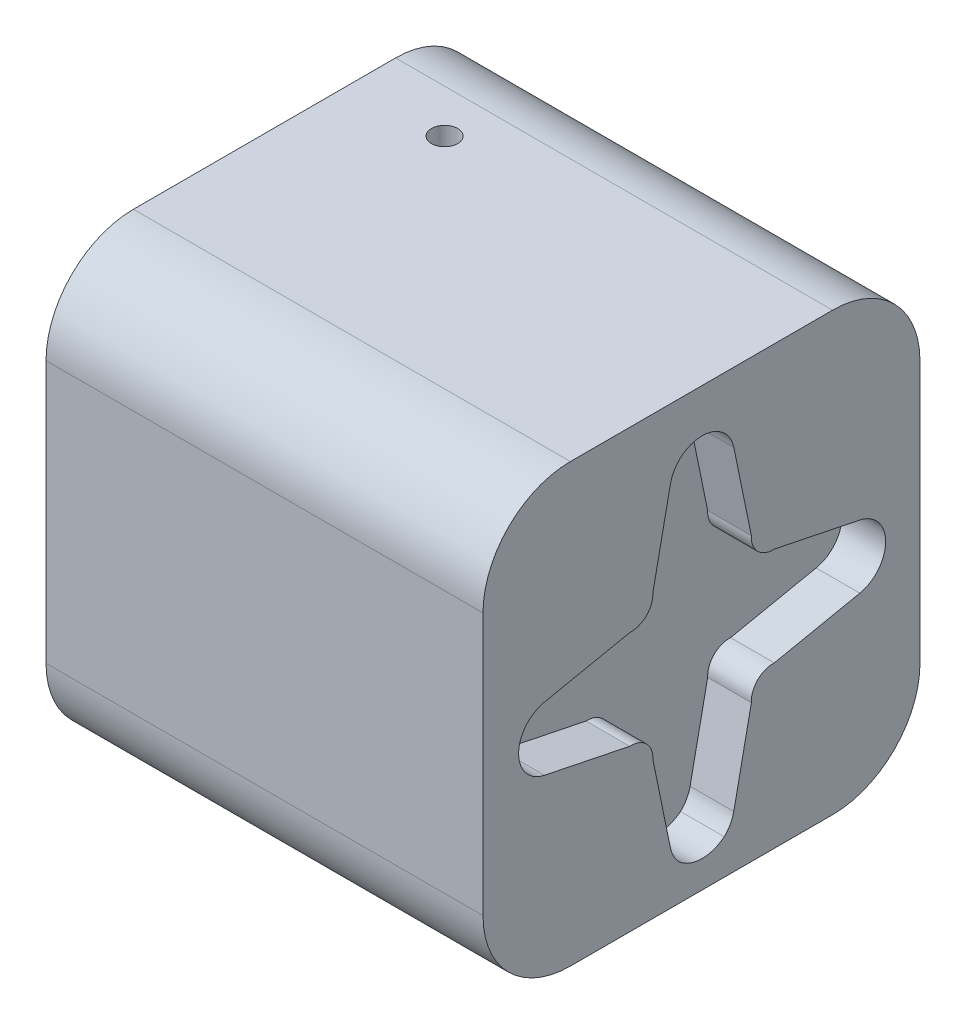
ISO-10303-21;
HEADER;
FILE_DESCRIPTION(('STEP AP214'),'2;1');
FILE_NAME('part.step','',(''),(''),'','','');
FILE_SCHEMA(('AUTOMOTIVE_DESIGN { 1 0 10303 214 1 1 1 1 }'));
ENDSEC;
DATA;
#1=APPLICATION_CONTEXT('core data for automotive mechanical design processes');
#2=APPLICATION_PROTOCOL_DEFINITION('international standard','automotive_design',2000,#1);
#3=PRODUCT_CONTEXT('',#1,'mechanical');
#4=PRODUCT('Part','Part','',(#3));
#5=PRODUCT_RELATED_PRODUCT_CATEGORY('part','',(#4));
#6=PRODUCT_DEFINITION_FORMATION('','',#4);
#7=PRODUCT_DEFINITION_CONTEXT('part definition',#1,'design');
#8=PRODUCT_DEFINITION('design','',#6,#7);
#9=PRODUCT_DEFINITION_SHAPE('','',#8);
#10=(LENGTH_UNIT() NAMED_UNIT(*) SI_UNIT(.MILLI.,.METRE.));
#11=(NAMED_UNIT(*) PLANE_ANGLE_UNIT() SI_UNIT($,.RADIAN.));
#12=(NAMED_UNIT(*) SI_UNIT($,.STERADIAN.) SOLID_ANGLE_UNIT());
#13=UNCERTAINTY_MEASURE_WITH_UNIT(LENGTH_MEASURE(1.E-05),#10,'distance_accuracy_value','');
#14=(GEOMETRIC_REPRESENTATION_CONTEXT(3) GLOBAL_UNCERTAINTY_ASSIGNED_CONTEXT((#13)) GLOBAL_UNIT_ASSIGNED_CONTEXT((#10,
#11,#12)) REPRESENTATION_CONTEXT('',''));
#15=CARTESIAN_POINT('',(0.,0.,0.));
#16=DIRECTION('',(0.,0.,1.));
#17=DIRECTION('',(1.,0.,0.));
#18=AXIS2_PLACEMENT_3D('',#15,#16,#17);
#19=CARTESIAN_POINT('',(0.,0.,50.));
#20=DIRECTION('',(1.,0.,0.));
#21=DIRECTION('',(0.,1.,0.));
#22=AXIS2_PLACEMENT_3D('',#19,#20,#21);
#23=PLANE('',#22);
#24=CARTESIAN_POINT('',(0.,24.8562562066084,24.9768909965409));
#25=DIRECTION('',(-1.,0.,0.));
#26=DIRECTION('',(0.,0.,1.));
#27=AXIS2_PLACEMENT_3D('',#24,#25,#26);
#28=CIRCLE('',#27,6.);
#29=CARTESIAN_POINT('',(0.,24.8562562066084,30.9768909965409));
#30=VERTEX_POINT('',#29);
#31=EDGE_CURVE('E364',#30,#30,#28,.T.);
#32=ORIENTED_EDGE('',*,*,#31,.F.);
#33=EDGE_LOOP('',(#32));
#34=FACE_BOUND('',#33,.T.);
#35=DIRECTION('',(0.,-1.,0.));
#36=VECTOR('',#35,1.);
#37=CARTESIAN_POINT('',(0.,0.,0.));
#38=LINE('',#37,#36);
#39=CARTESIAN_POINT('',(0.,40.,0.));
#40=VERTEX_POINT('',#39);
#41=CARTESIAN_POINT('',(0.,10.,0.));
#42=VERTEX_POINT('',#41);
#43=EDGE_CURVE('E370',#40,#42,#38,.T.);
#44=ORIENTED_EDGE('',*,*,#43,.T.);
#45=CARTESIAN_POINT('',(0.,10.,10.));
#46=DIRECTION('',(1.,0.,0.));
#47=DIRECTION('',(0.,1.,0.));
#48=AXIS2_PLACEMENT_3D('',#45,#46,#47);
#49=CIRCLE('',#48,10.);
#50=CARTESIAN_POINT('',(0.,0.,10.));
#51=VERTEX_POINT('',#50);
#52=EDGE_CURVE('E418',#42,#51,#49,.F.);
#53=ORIENTED_EDGE('',*,*,#52,.T.);
#54=DIRECTION('',(0.,0.,-1.));
#55=VECTOR('',#54,1.);
#56=CARTESIAN_POINT('',(0.,0.,50.));
#57=LINE('',#56,#55);
#58=CARTESIAN_POINT('',(0.,0.,40.));
#59=VERTEX_POINT('',#58);
#60=EDGE_CURVE('E393',#59,#51,#57,.T.);
#61=ORIENTED_EDGE('',*,*,#60,.F.);
#62=CARTESIAN_POINT('',(0.,10.,40.));
#63=DIRECTION('',(1.,0.,0.));
#64=DIRECTION('',(0.,1.,0.));
#65=AXIS2_PLACEMENT_3D('',#62,#63,#64);
#66=CIRCLE('',#65,10.);
#67=CARTESIAN_POINT('',(0.,10.,50.));
#68=VERTEX_POINT('',#67);
#69=EDGE_CURVE('E416',#59,#68,#66,.F.);
#70=ORIENTED_EDGE('',*,*,#69,.T.);
#71=DIRECTION('',(0.,-1.,0.));
#72=VECTOR('',#71,1.);
#73=CARTESIAN_POINT('',(0.,0.,50.));
#74=LINE('',#73,#72);
#75=CARTESIAN_POINT('',(0.,40.,50.));
#76=VERTEX_POINT('',#75);
#77=EDGE_CURVE('E373',#76,#68,#74,.T.);
#78=ORIENTED_EDGE('',*,*,#77,.F.);
#79=CARTESIAN_POINT('',(0.,40.,40.));
#80=DIRECTION('',(1.,0.,0.));
#81=DIRECTION('',(0.,1.,0.));
#82=AXIS2_PLACEMENT_3D('',#79,#80,#81);
#83=CIRCLE('',#82,10.);
#84=CARTESIAN_POINT('',(0.,50.,40.));
#85=VERTEX_POINT('',#84);
#86=EDGE_CURVE('E413',#76,#85,#83,.F.);
#87=ORIENTED_EDGE('',*,*,#86,.T.);
#88=DIRECTION('',(0.,0.,-1.));
#89=VECTOR('',#88,1.);
#90=CARTESIAN_POINT('',(0.,50.,50.));
#91=LINE('',#90,#89);
#92=CARTESIAN_POINT('',(0.,50.,10.));
#93=VERTEX_POINT('',#92);
#94=EDGE_CURVE('E380',#85,#93,#91,.T.);
#95=ORIENTED_EDGE('',*,*,#94,.T.);
#96=CARTESIAN_POINT('',(0.,40.,10.));
#97=DIRECTION('',(1.,0.,0.));
#98=DIRECTION('',(0.,1.,0.));
#99=AXIS2_PLACEMENT_3D('',#96,#97,#98);
#100=CIRCLE('',#99,10.);
#101=EDGE_CURVE('E60',#93,#40,#100,.F.);
#102=ORIENTED_EDGE('',*,*,#101,.T.);
#103=EDGE_LOOP('',(#44,#53,#61,#70,#78,#87,#95,#102));
#104=FACE_BOUND('',#103,.T.);
#105=ADVANCED_FACE('F37',(#34,#104),#23,.F.);
#106=CARTESIAN_POINT('',(0.,0.,50.));
#107=DIRECTION('',(0.,1.,0.));
#108=DIRECTION('',(0.,0.,1.));
#109=AXIS2_PLACEMENT_3D('',#106,#107,#108);
#110=PLANE('',#109);
#111=ORIENTED_EDGE('',*,*,#60,.T.);
#112=DIRECTION('',(1.,0.,0.));
#113=VECTOR('',#112,1.);
#114=CARTESIAN_POINT('',(50.,0.,10.));
#115=LINE('',#114,#113);
#116=CARTESIAN_POINT('',(50.,0.,10.));
#117=VERTEX_POINT('',#116);
#118=EDGE_CURVE('E398',#51,#117,#115,.T.);
#119=ORIENTED_EDGE('',*,*,#118,.T.);
#120=DIRECTION('',(0.,0.,-1.));
#121=VECTOR('',#120,1.);
#122=CARTESIAN_POINT('',(50.,0.,50.));
#123=LINE('',#122,#121);
#124=CARTESIAN_POINT('',(50.,0.,40.));
#125=VERTEX_POINT('',#124);
#126=EDGE_CURVE('E390',#125,#117,#123,.T.);
#127=ORIENTED_EDGE('',*,*,#126,.F.);
#128=DIRECTION('',(1.,0.,0.));
#129=VECTOR('',#128,1.);
#130=CARTESIAN_POINT('',(0.,0.,40.));
#131=LINE('',#130,#129);
#132=EDGE_CURVE('E396',#125,#59,#131,.F.);
#133=ORIENTED_EDGE('',*,*,#132,.T.);
#134=EDGE_LOOP('',(#111,#119,#127,#133));
#135=FACE_BOUND('',#134,.T.);
#136=ADVANCED_FACE('F449',(#135),#110,.F.);
#137=CARTESIAN_POINT('',(50.,0.,50.));
#138=DIRECTION('',(-1.,0.,0.));
#139=DIRECTION('',(0.,-1.,0.));
#140=AXIS2_PLACEMENT_3D('',#137,#138,#139);
#141=PLANE('',#140);
#142=CARTESIAN_POINT('',(50.,6.71979854378887,24.9265546119493));
#143=DIRECTION('',(1.,0.,0.));
#144=DIRECTION('',(0.,0.,1.));
#145=AXIS2_PLACEMENT_3D('',#142,#143,#144);
#146=CIRCLE('',#145,3.69999999999998);
#147=CARTESIAN_POINT('',(50.,4.01979854378889,22.3967324838146));
#148=VERTEX_POINT('',#147);
#149=CARTESIAN_POINT('',(50.,5.9744061390126,21.3024146915128));
#150=VERTEX_POINT('',#149);
#151=EDGE_CURVE('E281',#148,#150,#146,.T.);
#152=ORIENTED_EDGE('',*,*,#151,.F.);
#153=CARTESIAN_POINT('',(50.,7.14141936196997,24.9265546119493));
#154=DIRECTION('',(1.,0.,0.));
#155=DIRECTION('',(0.,0.,1.));
#156=AXIS2_PLACEMENT_3D('',#153,#154,#155);
#157=CIRCLE('',#156,4.01802395867688);
#158=CARTESIAN_POINT('',(50.,4.01979854378889,27.456376740084));
#159=VERTEX_POINT('',#158);
#160=EDGE_CURVE('E52',#159,#148,#157,.T.);
#161=ORIENTED_EDGE('',*,*,#160,.F.);
#162=CARTESIAN_POINT('',(50.,6.71979854378887,24.9265546119493));
#163=DIRECTION('',(1.,0.,0.));
#164=DIRECTION('',(0.,0.,1.));
#165=AXIS2_PLACEMENT_3D('',#162,#163,#164);
#166=CIRCLE('',#165,3.69999999999998);
#167=CARTESIAN_POINT('',(50.,5.97440613901261,28.5506945323859));
#168=VERTEX_POINT('',#167);
#169=EDGE_CURVE('E231',#168,#159,#166,.T.);
#170=ORIENTED_EDGE('',*,*,#169,.F.);
#171=DIRECTION('',(0.,-0.979497275793663,-0.201457406696287));
#172=VECTOR('',#171,1.);
#173=CARTESIAN_POINT('',(50.,15.7531316322469,30.5619269547176));
#174=LINE('',#173,#172);
#175=CARTESIAN_POINT('',(50.,15.7531316322469,30.5619269547176));
#176=VERTEX_POINT('',#175);
#177=EDGE_CURVE('E234',#176,#168,#174,.T.);
#178=ORIENTED_EDGE('',*,*,#177,.F.);
#179=CARTESIAN_POINT('',(50.,15.8880705601436,33.0582825955946));
#180=DIRECTION('',(-1.,0.,0.));
#181=DIRECTION('',(0.,0.,1.));
#182=AXIS2_PLACEMENT_3D('',#179,#180,#181);
#183=CIRCLE('',#182,2.5);
#184=CARTESIAN_POINT('',(50.,18.3844262010205,33.1932215234913));
#185=VERTEX_POINT('',#184);
#186=EDGE_CURVE('E322',#185,#176,#183,.T.);
#187=ORIENTED_EDGE('',*,*,#186,.F.);
#188=DIRECTION('',(0.,-0.201457406696296,-0.979497275793661));
#189=VECTOR('',#188,1.);
#190=CARTESIAN_POINT('',(50.,18.3844262010205,33.1932215234913));
#191=LINE('',#190,#189);
#192=CARTESIAN_POINT('',(50.,20.3956586233524,42.9719470167256));
#193=VERTEX_POINT('',#192);
#194=EDGE_CURVE('E319',#193,#185,#191,.T.);
#195=ORIENTED_EDGE('',*,*,#194,.F.);
#196=CARTESIAN_POINT('',(50.,24.0197985437889,42.2265546119493));
#197=DIRECTION('',(1.,0.,0.));
#198=DIRECTION('',(0.,0.,-1.));
#199=AXIS2_PLACEMENT_3D('',#196,#197,#198);
#200=CIRCLE('',#199,3.7);
#201=CARTESIAN_POINT('',(50.,27.6439384642254,42.9719470167256));
#202=VERTEX_POINT('',#201);
#203=EDGE_CURVE('E316',#202,#193,#200,.T.);
#204=ORIENTED_EDGE('',*,*,#203,.F.);
#205=DIRECTION('',(0.,-0.201457406696295,0.979497275793661));
#206=VECTOR('',#205,1.);
#207=CARTESIAN_POINT('',(50.,29.6551708865573,33.1932215234912));
#208=LINE('',#207,#206);
#209=CARTESIAN_POINT('',(50.,29.6551708865573,33.1932215234912));
#210=VERTEX_POINT('',#209);
#211=EDGE_CURVE('E313',#210,#202,#208,.T.);
#212=ORIENTED_EDGE('',*,*,#211,.F.);
#213=CARTESIAN_POINT('',(50.,32.1515265274343,33.0582825955946));
#214=DIRECTION('',(-1.,0.,0.));
#215=DIRECTION('',(0.,0.,-1.));
#216=AXIS2_PLACEMENT_3D('',#213,#214,#215);
#217=CIRCLE('',#216,2.50000000000001);
#218=CARTESIAN_POINT('',(50.,32.2864654553309,30.5619269547176));
#219=VERTEX_POINT('',#218);
#220=EDGE_CURVE('E310',#219,#210,#217,.T.);
#221=ORIENTED_EDGE('',*,*,#220,.F.);
#222=DIRECTION('',(0.,-0.979497275793663,0.201457406696289));
#223=VECTOR('',#222,1.);
#224=CARTESIAN_POINT('',(50.,32.2864654553309,30.5619269547176));
#225=LINE('',#224,#223);
#226=CARTESIAN_POINT('',(50.,42.0651909485652,28.5506945323858));
#227=VERTEX_POINT('',#226);
#228=EDGE_CURVE('E307',#227,#219,#225,.T.);
#229=ORIENTED_EDGE('',*,*,#228,.F.);
#230=CARTESIAN_POINT('',(50.,41.3197985437889,24.9265546119493));
#231=DIRECTION('',(1.,0.,0.));
#232=DIRECTION('',(0.,0.,-1.));
#233=AXIS2_PLACEMENT_3D('',#230,#231,#232);
#234=CIRCLE('',#233,3.69999999999999);
#235=CARTESIAN_POINT('',(50.,42.0651909485652,21.3024146915128));
#236=VERTEX_POINT('',#235);
#237=EDGE_CURVE('E304',#236,#227,#234,.T.);
#238=ORIENTED_EDGE('',*,*,#237,.F.);
#239=DIRECTION('',(0.,0.979497275793662,0.201457406696289));
#240=VECTOR('',#239,1.);
#241=CARTESIAN_POINT('',(50.,32.2864654553309,19.291182269181));
#242=LINE('',#241,#240);
#243=CARTESIAN_POINT('',(50.,32.2864654553309,19.291182269181));
#244=VERTEX_POINT('',#243);
#245=EDGE_CURVE('E301',#244,#236,#242,.T.);
#246=ORIENTED_EDGE('',*,*,#245,.F.);
#247=CARTESIAN_POINT('',(50.,32.1515265274342,16.7948266283041));
#248=DIRECTION('',(-1.,0.,0.));
#249=DIRECTION('',(0.,0.,1.));
#250=AXIS2_PLACEMENT_3D('',#247,#248,#249);
#251=CIRCLE('',#250,2.5);
#252=CARTESIAN_POINT('',(50.,29.6551708865573,16.6598877004074));
#253=VERTEX_POINT('',#252);
#254=EDGE_CURVE('E298',#253,#244,#251,.T.);
#255=ORIENTED_EDGE('',*,*,#254,.F.);
#256=DIRECTION('',(0.,0.201457406696297,0.979497275793661));
#257=VECTOR('',#256,1.);
#258=CARTESIAN_POINT('',(50.,29.6551708865573,16.6598877004074));
#259=LINE('',#258,#257);
#260=CARTESIAN_POINT('',(50.,27.6439384642254,6.88116220717301));
#261=VERTEX_POINT('',#260);
#262=EDGE_CURVE('E295',#261,#253,#259,.T.);
#263=ORIENTED_EDGE('',*,*,#262,.F.);
#264=CARTESIAN_POINT('',(50.,24.0197985437889,7.62655461194931));
#265=DIRECTION('',(1.,0.,0.));
#266=DIRECTION('',(0.,0.,1.));
#267=AXIS2_PLACEMENT_3D('',#264,#265,#266);
#268=CIRCLE('',#267,3.7);
#269=CARTESIAN_POINT('',(50.,20.3956586233524,6.88116220717299));
#270=VERTEX_POINT('',#269);
#271=EDGE_CURVE('E292',#270,#261,#268,.T.);
#272=ORIENTED_EDGE('',*,*,#271,.F.);
#273=DIRECTION('',(0.,0.201457406696295,-0.979497275793661));
#274=VECTOR('',#273,1.);
#275=CARTESIAN_POINT('',(50.,18.3844262010205,16.6598877004073));
#276=LINE('',#275,#274);
#277=CARTESIAN_POINT('',(50.,18.3844262010205,16.6598877004073));
#278=VERTEX_POINT('',#277);
#279=EDGE_CURVE('E289',#278,#270,#276,.T.);
#280=ORIENTED_EDGE('',*,*,#279,.F.);
#281=CARTESIAN_POINT('',(50.,15.8880705601436,16.7948266283041));
#282=DIRECTION('',(-1.,0.,0.));
#283=DIRECTION('',(0.,0.,-1.));
#284=AXIS2_PLACEMENT_3D('',#281,#282,#283);
#285=CIRCLE('',#284,2.5);
#286=CARTESIAN_POINT('',(50.,15.7531316322469,19.291182269181));
#287=VERTEX_POINT('',#286);
#288=EDGE_CURVE('E286',#287,#278,#285,.T.);
#289=ORIENTED_EDGE('',*,*,#288,.F.);
#290=DIRECTION('',(0.,0.979497275793662,-0.20145740669629));
#291=VECTOR('',#290,1.);
#292=CARTESIAN_POINT('',(50.,15.7531316322469,19.291182269181));
#293=LINE('',#292,#291);
#294=EDGE_CURVE('E283',#150,#287,#293,.T.);
#295=ORIENTED_EDGE('',*,*,#294,.F.);
#296=EDGE_LOOP('',(#152,#161,#170,#178,#187,#195,#204,#212,#221,#229,#238,#246,#255,#263,#272,
#280,#289,#295));
#297=FACE_BOUND('',#296,.T.);
#298=ORIENTED_EDGE('',*,*,#126,.T.);
#299=CARTESIAN_POINT('',(50.,10.,10.));
#300=DIRECTION('',(-1.,0.,0.));
#301=DIRECTION('',(0.,-1.,0.));
#302=AXIS2_PLACEMENT_3D('',#299,#300,#301);
#303=CIRCLE('',#302,10.);
#304=CARTESIAN_POINT('',(50.,10.,0.));
#305=VERTEX_POINT('',#304);
#306=EDGE_CURVE('E407',#117,#305,#303,.F.);
#307=ORIENTED_EDGE('',*,*,#306,.T.);
#308=DIRECTION('',(0.,1.,0.));
#309=VECTOR('',#308,1.);
#310=CARTESIAN_POINT('',(50.,0.,0.));
#311=LINE('',#310,#309);
#312=CARTESIAN_POINT('',(50.,40.,0.));
#313=VERTEX_POINT('',#312);
#314=EDGE_CURVE('E377',#305,#313,#311,.T.);
#315=ORIENTED_EDGE('',*,*,#314,.T.);
#316=CARTESIAN_POINT('',(50.,40.,10.));
#317=DIRECTION('',(-1.,0.,0.));
#318=DIRECTION('',(0.,-1.,0.));
#319=AXIS2_PLACEMENT_3D('',#316,#317,#318);
#320=CIRCLE('',#319,10.);
#321=CARTESIAN_POINT('',(50.,50.,10.));
#322=VERTEX_POINT('',#321);
#323=EDGE_CURVE('E403',#313,#322,#320,.F.);
#324=ORIENTED_EDGE('',*,*,#323,.T.);
#325=DIRECTION('',(0.,0.,-1.));
#326=VECTOR('',#325,1.);
#327=CARTESIAN_POINT('',(50.,50.,50.));
#328=LINE('',#327,#326);
#329=CARTESIAN_POINT('',(50.,50.,40.));
#330=VERTEX_POINT('',#329);
#331=EDGE_CURVE('E387',#330,#322,#328,.T.);
#332=ORIENTED_EDGE('',*,*,#331,.F.);
#333=CARTESIAN_POINT('',(50.,40.,40.));
#334=DIRECTION('',(-1.,0.,0.));
#335=DIRECTION('',(0.,-1.,0.));
#336=AXIS2_PLACEMENT_3D('',#333,#334,#335);
#337=CIRCLE('',#336,10.);
#338=CARTESIAN_POINT('',(50.,40.,50.));
#339=VERTEX_POINT('',#338);
#340=EDGE_CURVE('E401',#330,#339,#337,.F.);
#341=ORIENTED_EDGE('',*,*,#340,.T.);
#342=DIRECTION('',(0.,1.,0.));
#343=VECTOR('',#342,1.);
#344=CARTESIAN_POINT('',(50.,0.,50.));
#345=LINE('',#344,#343);
#346=CARTESIAN_POINT('',(50.,10.,50.));
#347=VERTEX_POINT('',#346);
#348=EDGE_CURVE('E376',#347,#339,#345,.T.);
#349=ORIENTED_EDGE('',*,*,#348,.F.);
#350=CARTESIAN_POINT('',(50.,10.,40.));
#351=DIRECTION('',(-1.,0.,0.));
#352=DIRECTION('',(0.,-1.,0.));
#353=AXIS2_PLACEMENT_3D('',#350,#351,#352);
#354=CIRCLE('',#353,10.);
#355=EDGE_CURVE('E405',#347,#125,#354,.F.);
#356=ORIENTED_EDGE('',*,*,#355,.T.);
#357=EDGE_LOOP('',(#298,#307,#315,#324,#332,#341,#349,#356));
#358=FACE_BOUND('',#357,.T.);
#359=ADVANCED_FACE('F433',(#297,#358),#141,.F.);
#360=CARTESIAN_POINT('',(0.,50.,50.));
#361=DIRECTION('',(0.,-1.,0.));
#362=DIRECTION('',(0.,0.,-1.));
#363=AXIS2_PLACEMENT_3D('',#360,#361,#362);
#364=PLANE('',#363);
#365=CARTESIAN_POINT('',(10.5467381359211,50.,14.9409623138058));
#366=DIRECTION('',(0.,1.,0.));
#367=DIRECTION('',(0.,0.,1.));
#368=AXIS2_PLACEMENT_3D('',#365,#366,#367);
#369=CIRCLE('',#368,1.5);
#370=CARTESIAN_POINT('',(10.5467381359211,50.,16.4409623138058));
#371=VERTEX_POINT('',#370);
#372=EDGE_CURVE('E329',#371,#371,#369,.T.);
#373=ORIENTED_EDGE('',*,*,#372,.F.);
#374=EDGE_LOOP('',(#373));
#375=FACE_BOUND('',#374,.T.);
#376=ORIENTED_EDGE('',*,*,#331,.T.);
#377=DIRECTION('',(-1.,0.,0.));
#378=VECTOR('',#377,1.);
#379=CARTESIAN_POINT('',(0.,50.,10.));
#380=LINE('',#379,#378);
#381=EDGE_CURVE('E11',#322,#93,#380,.T.);
#382=ORIENTED_EDGE('',*,*,#381,.T.);
#383=ORIENTED_EDGE('',*,*,#94,.F.);
#384=DIRECTION('',(-1.,0.,0.));
#385=VECTOR('',#384,1.);
#386=CARTESIAN_POINT('',(0.,50.,40.));
#387=LINE('',#386,#385);
#388=EDGE_CURVE('E45',#85,#330,#387,.F.);
#389=ORIENTED_EDGE('',*,*,#388,.T.);
#390=EDGE_LOOP('',(#376,#382,#383,#389));
#391=FACE_BOUND('',#390,.T.);
#392=ADVANCED_FACE('F429',(#375,#391),#364,.F.);
#393=CARTESIAN_POINT('',(0.,0.,50.));
#394=DIRECTION('',(0.,0.,-1.));
#395=DIRECTION('',(-1.,0.,0.));
#396=AXIS2_PLACEMENT_3D('',#393,#394,#395);
#397=PLANE('',#396);
#398=ORIENTED_EDGE('',*,*,#77,.T.);
#399=DIRECTION('',(1.,0.,0.));
#400=VECTOR('',#399,1.);
#401=CARTESIAN_POINT('',(0.,10.,50.));
#402=LINE('',#401,#400);
#403=EDGE_CURVE('E423',#68,#347,#402,.T.);
#404=ORIENTED_EDGE('',*,*,#403,.T.);
#405=ORIENTED_EDGE('',*,*,#348,.T.);
#406=DIRECTION('',(-1.,0.,0.));
#407=VECTOR('',#406,1.);
#408=CARTESIAN_POINT('',(0.,40.,50.));
#409=LINE('',#408,#407);
#410=EDGE_CURVE('E420',#339,#76,#409,.T.);
#411=ORIENTED_EDGE('',*,*,#410,.T.);
#412=EDGE_LOOP('',(#398,#404,#405,#411));
#413=FACE_BOUND('',#412,.T.);
#414=ADVANCED_FACE('F439',(#413),#397,.F.);
#415=CARTESIAN_POINT('',(0.,0.,0.));
#416=DIRECTION('',(0.,0.,-1.));
#417=DIRECTION('',(-1.,0.,0.));
#418=AXIS2_PLACEMENT_3D('',#415,#416,#417);
#419=PLANE('',#418);
#420=ORIENTED_EDGE('',*,*,#314,.F.);
#421=DIRECTION('',(1.,0.,0.));
#422=VECTOR('',#421,1.);
#423=CARTESIAN_POINT('',(0.,10.,0.));
#424=LINE('',#423,#422);
#425=EDGE_CURVE('E411',#305,#42,#424,.F.);
#426=ORIENTED_EDGE('',*,*,#425,.T.);
#427=ORIENTED_EDGE('',*,*,#43,.F.);
#428=DIRECTION('',(-1.,0.,0.));
#429=VECTOR('',#428,1.);
#430=CARTESIAN_POINT('',(50.,40.,0.));
#431=LINE('',#430,#429);
#432=EDGE_CURVE('E409',#40,#313,#431,.F.);
#433=ORIENTED_EDGE('',*,*,#432,.T.);
#434=EDGE_LOOP('',(#420,#426,#427,#433));
#435=FACE_BOUND('',#434,.T.);
#436=ADVANCED_FACE('F457',(#435),#419,.T.);
#437=CARTESIAN_POINT('',(40.,24.8562562066084,24.9768909965409));
#438=DIRECTION('',(-1.,0.,0.));
#439=DIRECTION('',(0.,0.,1.));
#440=AXIS2_PLACEMENT_3D('',#437,#438,#439);
#441=CYLINDRICAL_SURFACE('',#440,6.);
#442=CARTESIAN_POINT('',(40.,24.8562562066084,24.9768909965409));
#443=DIRECTION('',(-1.,0.,0.));
#444=DIRECTION('',(0.,0.,1.));
#445=AXIS2_PLACEMENT_3D('',#442,#443,#444);
#446=CIRCLE('',#445,6.);
#447=CARTESIAN_POINT('',(40.,24.8562562066084,30.9768909965409));
#448=VERTEX_POINT('',#447);
#449=EDGE_CURVE('E367',#448,#448,#446,.T.);
#450=ORIENTED_EDGE('',*,*,#449,.F.);
#451=EDGE_LOOP('',(#450));
#452=FACE_BOUND('',#451,.T.);
#453=ORIENTED_EDGE('',*,*,#31,.T.);
#454=EDGE_LOOP('',(#453));
#455=FACE_BOUND('',#454,.T.);
#456=ADVANCED_FACE('F482',(#452,#455),#441,.F.);
#457=CARTESIAN_POINT('',(40.,24.8562562066084,24.9768909965409));
#458=DIRECTION('',(-1.,0.,0.));
#459=DIRECTION('',(0.,0.,1.));
#460=AXIS2_PLACEMENT_3D('',#457,#458,#459);
#461=PLANE('',#460);
#462=ORIENTED_EDGE('',*,*,#449,.T.);
#463=EDGE_LOOP('',(#462));
#464=FACE_BOUND('',#463,.T.);
#465=ADVANCED_FACE('F478',(#464),#461,.T.);
#466=CARTESIAN_POINT('',(0.,10.,10.));
#467=DIRECTION('',(-1.,0.,0.));
#468=DIRECTION('',(0.,0.,1.));
#469=AXIS2_PLACEMENT_3D('',#466,#467,#468);
#470=CYLINDRICAL_SURFACE('',#469,10.);
#471=ORIENTED_EDGE('',*,*,#52,.F.);
#472=ORIENTED_EDGE('',*,*,#425,.F.);
#473=ORIENTED_EDGE('',*,*,#306,.F.);
#474=ORIENTED_EDGE('',*,*,#118,.F.);
#475=EDGE_LOOP('',(#471,#472,#473,#474));
#476=FACE_BOUND('',#475,.T.);
#477=ADVANCED_FACE('F453',(#476),#470,.T.);
#478=CARTESIAN_POINT('',(0.,10.,40.));
#479=DIRECTION('',(1.,0.,0.));
#480=DIRECTION('',(0.,0.,-1.));
#481=AXIS2_PLACEMENT_3D('',#478,#479,#480);
#482=CYLINDRICAL_SURFACE('',#481,10.);
#483=ORIENTED_EDGE('',*,*,#69,.F.);
#484=ORIENTED_EDGE('',*,*,#132,.F.);
#485=ORIENTED_EDGE('',*,*,#355,.F.);
#486=ORIENTED_EDGE('',*,*,#403,.F.);
#487=EDGE_LOOP('',(#483,#484,#485,#486));
#488=FACE_BOUND('',#487,.T.);
#489=ADVANCED_FACE('F446',(#488),#482,.T.);
#490=CARTESIAN_POINT('',(0.,40.,10.));
#491=DIRECTION('',(1.,0.,0.));
#492=DIRECTION('',(0.,0.,-1.));
#493=AXIS2_PLACEMENT_3D('',#490,#491,#492);
#494=CYLINDRICAL_SURFACE('',#493,10.);
#495=ORIENTED_EDGE('',*,*,#323,.F.);
#496=ORIENTED_EDGE('',*,*,#432,.F.);
#497=ORIENTED_EDGE('',*,*,#101,.F.);
#498=ORIENTED_EDGE('',*,*,#381,.F.);
#499=EDGE_LOOP('',(#495,#496,#497,#498));
#500=FACE_BOUND('',#499,.T.);
#501=ADVANCED_FACE('F459',(#500),#494,.T.);
#502=CARTESIAN_POINT('',(0.,40.,40.));
#503=DIRECTION('',(-1.,0.,0.));
#504=DIRECTION('',(0.,0.,1.));
#505=AXIS2_PLACEMENT_3D('',#502,#503,#504);
#506=CYLINDRICAL_SURFACE('',#505,10.);
#507=ORIENTED_EDGE('',*,*,#340,.F.);
#508=ORIENTED_EDGE('',*,*,#388,.F.);
#509=ORIENTED_EDGE('',*,*,#86,.F.);
#510=ORIENTED_EDGE('',*,*,#410,.F.);
#511=EDGE_LOOP('',(#507,#508,#509,#510));
#512=FACE_BOUND('',#511,.T.);
#513=ADVANCED_FACE('F39',(#512),#506,.T.);
#514=CARTESIAN_POINT('',(10.5467381359211,35.,14.9409623138058));
#515=DIRECTION('',(0.,1.,0.));
#516=DIRECTION('',(0.,0.,1.));
#517=AXIS2_PLACEMENT_3D('',#514,#515,#516);
#518=CYLINDRICAL_SURFACE('',#517,1.5);
#519=CARTESIAN_POINT('',(10.5467381359211,35.,14.9409623138058));
#520=DIRECTION('',(0.,1.,0.));
#521=DIRECTION('',(0.,0.,1.));
#522=AXIS2_PLACEMENT_3D('',#519,#520,#521);
#523=CIRCLE('',#522,1.5);
#524=CARTESIAN_POINT('',(10.5467381359211,35.,16.4409623138058));
#525=VERTEX_POINT('',#524);
#526=EDGE_CURVE('E361',#525,#525,#523,.T.);
#527=ORIENTED_EDGE('',*,*,#526,.F.);
#528=EDGE_LOOP('',(#527));
#529=FACE_BOUND('',#528,.T.);
#530=ORIENTED_EDGE('',*,*,#372,.T.);
#531=EDGE_LOOP('',(#530));
#532=FACE_BOUND('',#531,.T.);
#533=ADVANCED_FACE('F465',(#529,#532),#518,.F.);
#534=CARTESIAN_POINT('',(10.5467381359211,35.,14.9409623138058));
#535=DIRECTION('',(0.,1.,0.));
#536=DIRECTION('',(0.,0.,1.));
#537=AXIS2_PLACEMENT_3D('',#534,#535,#536);
#538=PLANE('',#537);
#539=ORIENTED_EDGE('',*,*,#526,.T.);
#540=EDGE_LOOP('',(#539));
#541=FACE_BOUND('',#540,.T.);
#542=ADVANCED_FACE('F572',(#541),#538,.T.);
#543=CARTESIAN_POINT('',(45.,7.14141936196997,24.9265546119493));
#544=DIRECTION('',(1.,0.,0.));
#545=DIRECTION('',(0.,0.,-1.));
#546=AXIS2_PLACEMENT_3D('',#543,#544,#545);
#547=CYLINDRICAL_SURFACE('',#546,4.01802395867688);
#548=ORIENTED_EDGE('',*,*,#160,.T.);
#549=DIRECTION('',(1.,0.,0.));
#550=VECTOR('',#549,1.);
#551=CARTESIAN_POINT('',(45.,4.01979854378889,22.3967324838146));
#552=LINE('',#551,#550);
#553=CARTESIAN_POINT('',(45.,4.01979854378889,22.3967324838146));
#554=VERTEX_POINT('',#553);
#555=EDGE_CURVE('E208',#554,#148,#552,.T.);
#556=ORIENTED_EDGE('',*,*,#555,.F.);
#557=CARTESIAN_POINT('',(45.,7.14141936196997,24.9265546119493));
#558=DIRECTION('',(1.,0.,0.));
#559=DIRECTION('',(0.,0.,1.));
#560=AXIS2_PLACEMENT_3D('',#557,#558,#559);
#561=CIRCLE('',#560,4.01802395867688);
#562=CARTESIAN_POINT('',(45.,4.01979854378889,27.456376740084));
#563=VERTEX_POINT('',#562);
#564=EDGE_CURVE('E212',#563,#554,#561,.T.);
#565=ORIENTED_EDGE('',*,*,#564,.F.);
#566=DIRECTION('',(1.,0.,0.));
#567=VECTOR('',#566,1.);
#568=CARTESIAN_POINT('',(45.,4.01979854378889,27.456376740084));
#569=LINE('',#568,#567);
#570=EDGE_CURVE('E327',#563,#159,#569,.T.);
#571=ORIENTED_EDGE('',*,*,#570,.T.);
#572=EDGE_LOOP('',(#548,#556,#565,#571));
#573=FACE_BOUND('',#572,.T.);
#574=ADVANCED_FACE('F210',(#573),#547,.F.);
#575=CARTESIAN_POINT('',(45.,6.71979854378887,24.9265546119493));
#576=DIRECTION('',(1.,0.,0.));
#577=DIRECTION('',(0.,0.,-1.));
#578=AXIS2_PLACEMENT_3D('',#575,#576,#577);
#579=CYLINDRICAL_SURFACE('',#578,3.69999999999998);
#580=ORIENTED_EDGE('',*,*,#169,.T.);
#581=ORIENTED_EDGE('',*,*,#570,.F.);
#582=CARTESIAN_POINT('',(45.,6.71979854378887,24.9265546119493));
#583=DIRECTION('',(1.,0.,0.));
#584=DIRECTION('',(0.,0.,1.));
#585=AXIS2_PLACEMENT_3D('',#582,#583,#584);
#586=CIRCLE('',#585,3.69999999999998);
#587=CARTESIAN_POINT('',(45.,5.97440613901261,28.5506945323859));
#588=VERTEX_POINT('',#587);
#589=EDGE_CURVE('E218',#588,#563,#586,.T.);
#590=ORIENTED_EDGE('',*,*,#589,.F.);
#591=DIRECTION('',(1.,0.,0.));
#592=VECTOR('',#591,1.);
#593=CARTESIAN_POINT('',(45.,5.97440613901261,28.5506945323859));
#594=LINE('',#593,#592);
#595=EDGE_CURVE('E330',#588,#168,#594,.T.);
#596=ORIENTED_EDGE('',*,*,#595,.T.);
#597=EDGE_LOOP('',(#580,#581,#590,#596));
#598=FACE_BOUND('',#597,.T.);
#599=ADVANCED_FACE('F564',(#598),#579,.F.);
#600=CARTESIAN_POINT('',(45.,15.7531316322469,30.5619269547176));
#601=DIRECTION('',(0.,-0.201457406696287,0.979497275793663));
#602=DIRECTION('',(0.,-0.979497275793663,-0.201457406696287));
#603=AXIS2_PLACEMENT_3D('',#600,#601,#602);
#604=PLANE('',#603);
#605=ORIENTED_EDGE('',*,*,#177,.T.);
#606=ORIENTED_EDGE('',*,*,#595,.F.);
#607=DIRECTION('',(0.,-0.979497275793663,-0.201457406696287));
#608=VECTOR('',#607,1.);
#609=CARTESIAN_POINT('',(45.,15.7531316322469,30.5619269547176));
#610=LINE('',#609,#608);
#611=CARTESIAN_POINT('',(45.,15.7531316322469,30.5619269547176));
#612=VERTEX_POINT('',#611);
#613=EDGE_CURVE('E277',#612,#588,#610,.T.);
#614=ORIENTED_EDGE('',*,*,#613,.F.);
#615=DIRECTION('',(1.,0.,0.));
#616=VECTOR('',#615,1.);
#617=CARTESIAN_POINT('',(45.,15.7531316322469,30.5619269547176));
#618=LINE('',#617,#616);
#619=EDGE_CURVE('E332',#612,#176,#618,.T.);
#620=ORIENTED_EDGE('',*,*,#619,.T.);
#621=EDGE_LOOP('',(#605,#606,#614,#620));
#622=FACE_BOUND('',#621,.T.);
#623=ADVANCED_FACE('F562',(#622),#604,.F.);
#624=CARTESIAN_POINT('',(45.,15.8880705601436,33.0582825955946));
#625=DIRECTION('',(1.,0.,0.));
#626=DIRECTION('',(0.,0.,-1.));
#627=AXIS2_PLACEMENT_3D('',#624,#625,#626);
#628=CYLINDRICAL_SURFACE('',#627,2.5);
#629=ORIENTED_EDGE('',*,*,#186,.T.);
#630=ORIENTED_EDGE('',*,*,#619,.F.);
#631=CARTESIAN_POINT('',(45.,15.8880705601436,33.0582825955946));
#632=DIRECTION('',(-1.,0.,0.));
#633=DIRECTION('',(0.,0.,1.));
#634=AXIS2_PLACEMENT_3D('',#631,#632,#633);
#635=CIRCLE('',#634,2.5);
#636=CARTESIAN_POINT('',(45.,18.3844262010205,33.1932215234913));
#637=VERTEX_POINT('',#636);
#638=EDGE_CURVE('E274',#637,#612,#635,.T.);
#639=ORIENTED_EDGE('',*,*,#638,.F.);
#640=DIRECTION('',(1.,0.,0.));
#641=VECTOR('',#640,1.);
#642=CARTESIAN_POINT('',(45.,18.3844262010205,33.1932215234913));
#643=LINE('',#642,#641);
#644=EDGE_CURVE('E334',#637,#185,#643,.T.);
#645=ORIENTED_EDGE('',*,*,#644,.T.);
#646=EDGE_LOOP('',(#629,#630,#639,#645));
#647=FACE_BOUND('',#646,.T.);
#648=ADVANCED_FACE('F558',(#647),#628,.T.);
#649=CARTESIAN_POINT('',(45.,18.3844262010205,33.1932215234913));
#650=DIRECTION('',(0.,-0.979497275793661,0.201457406696296));
#651=DIRECTION('',(0.,-0.201457406696296,-0.979497275793661));
#652=AXIS2_PLACEMENT_3D('',#649,#650,#651);
#653=PLANE('',#652);
#654=ORIENTED_EDGE('',*,*,#194,.T.);
#655=ORIENTED_EDGE('',*,*,#644,.F.);
#656=DIRECTION('',(0.,-0.201457406696296,-0.979497275793661));
#657=VECTOR('',#656,1.);
#658=CARTESIAN_POINT('',(45.,18.3844262010205,33.1932215234913));
#659=LINE('',#658,#657);
#660=CARTESIAN_POINT('',(45.,20.3956586233524,42.9719470167256));
#661=VERTEX_POINT('',#660);
#662=EDGE_CURVE('E271',#661,#637,#659,.T.);
#663=ORIENTED_EDGE('',*,*,#662,.F.);
#664=DIRECTION('',(1.,0.,0.));
#665=VECTOR('',#664,1.);
#666=CARTESIAN_POINT('',(45.,20.3956586233524,42.9719470167256));
#667=LINE('',#666,#665);
#668=EDGE_CURVE('E336',#661,#193,#667,.T.);
#669=ORIENTED_EDGE('',*,*,#668,.T.);
#670=EDGE_LOOP('',(#654,#655,#663,#669));
#671=FACE_BOUND('',#670,.T.);
#672=ADVANCED_FACE('F554',(#671),#653,.F.);
#673=CARTESIAN_POINT('',(45.,24.0197985437889,42.2265546119493));
#674=DIRECTION('',(1.,0.,0.));
#675=DIRECTION('',(0.,0.,-1.));
#676=AXIS2_PLACEMENT_3D('',#673,#674,#675);
#677=CYLINDRICAL_SURFACE('',#676,3.7);
#678=ORIENTED_EDGE('',*,*,#203,.T.);
#679=ORIENTED_EDGE('',*,*,#668,.F.);
#680=CARTESIAN_POINT('',(45.,24.0197985437889,42.2265546119493));
#681=DIRECTION('',(1.,0.,0.));
#682=DIRECTION('',(0.,0.,-1.));
#683=AXIS2_PLACEMENT_3D('',#680,#681,#682);
#684=CIRCLE('',#683,3.7);
#685=CARTESIAN_POINT('',(45.,27.6439384642254,42.9719470167256));
#686=VERTEX_POINT('',#685);
#687=EDGE_CURVE('E268',#686,#661,#684,.T.);
#688=ORIENTED_EDGE('',*,*,#687,.F.);
#689=DIRECTION('',(1.,0.,0.));
#690=VECTOR('',#689,1.);
#691=CARTESIAN_POINT('',(45.,27.6439384642254,42.9719470167256));
#692=LINE('',#691,#690);
#693=EDGE_CURVE('E338',#686,#202,#692,.T.);
#694=ORIENTED_EDGE('',*,*,#693,.T.);
#695=EDGE_LOOP('',(#678,#679,#688,#694));
#696=FACE_BOUND('',#695,.T.);
#697=ADVANCED_FACE('F550',(#696),#677,.F.);
#698=CARTESIAN_POINT('',(45.,29.6551708865573,33.1932215234912));
#699=DIRECTION('',(0.,0.979497275793661,0.201457406696295));
#700=DIRECTION('',(0.,-0.201457406696295,0.979497275793661));
#701=AXIS2_PLACEMENT_3D('',#698,#699,#700);
#702=PLANE('',#701);
#703=ORIENTED_EDGE('',*,*,#211,.T.);
#704=ORIENTED_EDGE('',*,*,#693,.F.);
#705=DIRECTION('',(0.,-0.201457406696295,0.979497275793661));
#706=VECTOR('',#705,1.);
#707=CARTESIAN_POINT('',(45.,29.6551708865573,33.1932215234912));
#708=LINE('',#707,#706);
#709=CARTESIAN_POINT('',(45.,29.6551708865573,33.1932215234912));
#710=VERTEX_POINT('',#709);
#711=EDGE_CURVE('E265',#710,#686,#708,.T.);
#712=ORIENTED_EDGE('',*,*,#711,.F.);
#713=DIRECTION('',(1.,0.,0.));
#714=VECTOR('',#713,1.);
#715=CARTESIAN_POINT('',(45.,29.6551708865573,33.1932215234912));
#716=LINE('',#715,#714);
#717=EDGE_CURVE('E340',#710,#210,#716,.T.);
#718=ORIENTED_EDGE('',*,*,#717,.T.);
#719=EDGE_LOOP('',(#703,#704,#712,#718));
#720=FACE_BOUND('',#719,.T.);
#721=ADVANCED_FACE('F546',(#720),#702,.F.);
#722=CARTESIAN_POINT('',(45.,32.1515265274343,33.0582825955946));
#723=DIRECTION('',(1.,0.,0.));
#724=DIRECTION('',(0.,0.,-1.));
#725=AXIS2_PLACEMENT_3D('',#722,#723,#724);
#726=CYLINDRICAL_SURFACE('',#725,2.50000000000001);
#727=ORIENTED_EDGE('',*,*,#220,.T.);
#728=ORIENTED_EDGE('',*,*,#717,.F.);
#729=CARTESIAN_POINT('',(45.,32.1515265274343,33.0582825955946));
#730=DIRECTION('',(-1.,0.,0.));
#731=DIRECTION('',(0.,0.,-1.));
#732=AXIS2_PLACEMENT_3D('',#729,#730,#731);
#733=CIRCLE('',#732,2.50000000000001);
#734=CARTESIAN_POINT('',(45.,32.2864654553309,30.5619269547176));
#735=VERTEX_POINT('',#734);
#736=EDGE_CURVE('E262',#735,#710,#733,.T.);
#737=ORIENTED_EDGE('',*,*,#736,.F.);
#738=DIRECTION('',(1.,0.,0.));
#739=VECTOR('',#738,1.);
#740=CARTESIAN_POINT('',(45.,32.2864654553309,30.5619269547176));
#741=LINE('',#740,#739);
#742=EDGE_CURVE('E342',#735,#219,#741,.T.);
#743=ORIENTED_EDGE('',*,*,#742,.T.);
#744=EDGE_LOOP('',(#727,#728,#737,#743));
#745=FACE_BOUND('',#744,.T.);
#746=ADVANCED_FACE('F542',(#745),#726,.T.);
#747=CARTESIAN_POINT('',(45.,32.2864654553309,30.5619269547176));
#748=DIRECTION('',(0.,0.201457406696289,0.979497275793663));
#749=DIRECTION('',(0.,-0.979497275793663,0.201457406696289));
#750=AXIS2_PLACEMENT_3D('',#747,#748,#749);
#751=PLANE('',#750);
#752=ORIENTED_EDGE('',*,*,#228,.T.);
#753=ORIENTED_EDGE('',*,*,#742,.F.);
#754=DIRECTION('',(0.,-0.979497275793663,0.201457406696289));
#755=VECTOR('',#754,1.);
#756=CARTESIAN_POINT('',(45.,32.2864654553309,30.5619269547176));
#757=LINE('',#756,#755);
#758=CARTESIAN_POINT('',(45.,42.0651909485652,28.5506945323858));
#759=VERTEX_POINT('',#758);
#760=EDGE_CURVE('E259',#759,#735,#757,.T.);
#761=ORIENTED_EDGE('',*,*,#760,.F.);
#762=DIRECTION('',(1.,0.,0.));
#763=VECTOR('',#762,1.);
#764=CARTESIAN_POINT('',(45.,42.0651909485652,28.5506945323858));
#765=LINE('',#764,#763);
#766=EDGE_CURVE('E344',#759,#227,#765,.T.);
#767=ORIENTED_EDGE('',*,*,#766,.T.);
#768=EDGE_LOOP('',(#752,#753,#761,#767));
#769=FACE_BOUND('',#768,.T.);
#770=ADVANCED_FACE('F538',(#769),#751,.F.);
#771=CARTESIAN_POINT('',(45.,41.3197985437889,24.9265546119493));
#772=DIRECTION('',(1.,0.,0.));
#773=DIRECTION('',(0.,0.,-1.));
#774=AXIS2_PLACEMENT_3D('',#771,#772,#773);
#775=CYLINDRICAL_SURFACE('',#774,3.69999999999999);
#776=ORIENTED_EDGE('',*,*,#237,.T.);
#777=ORIENTED_EDGE('',*,*,#766,.F.);
#778=CARTESIAN_POINT('',(45.,41.3197985437889,24.9265546119493));
#779=DIRECTION('',(1.,0.,0.));
#780=DIRECTION('',(0.,0.,-1.));
#781=AXIS2_PLACEMENT_3D('',#778,#779,#780);
#782=CIRCLE('',#781,3.69999999999999);
#783=CARTESIAN_POINT('',(45.,42.0651909485652,21.3024146915128));
#784=VERTEX_POINT('',#783);
#785=EDGE_CURVE('E256',#784,#759,#782,.T.);
#786=ORIENTED_EDGE('',*,*,#785,.F.);
#787=DIRECTION('',(1.,0.,0.));
#788=VECTOR('',#787,1.);
#789=CARTESIAN_POINT('',(45.,42.0651909485652,21.3024146915128));
#790=LINE('',#789,#788);
#791=EDGE_CURVE('E346',#784,#236,#790,.T.);
#792=ORIENTED_EDGE('',*,*,#791,.T.);
#793=EDGE_LOOP('',(#776,#777,#786,#792));
#794=FACE_BOUND('',#793,.T.);
#795=ADVANCED_FACE('F534',(#794),#775,.F.);
#796=CARTESIAN_POINT('',(45.,32.2864654553309,19.291182269181));
#797=DIRECTION('',(0.,0.201457406696289,-0.979497275793662));
#798=DIRECTION('',(0.,0.979497275793663,0.201457406696289));
#799=AXIS2_PLACEMENT_3D('',#796,#797,#798);
#800=PLANE('',#799);
#801=ORIENTED_EDGE('',*,*,#245,.T.);
#802=ORIENTED_EDGE('',*,*,#791,.F.);
#803=DIRECTION('',(0.,0.979497275793662,0.201457406696289));
#804=VECTOR('',#803,1.);
#805=CARTESIAN_POINT('',(45.,32.2864654553309,19.291182269181));
#806=LINE('',#805,#804);
#807=CARTESIAN_POINT('',(45.,32.2864654553309,19.291182269181));
#808=VERTEX_POINT('',#807);
#809=EDGE_CURVE('E253',#808,#784,#806,.T.);
#810=ORIENTED_EDGE('',*,*,#809,.F.);
#811=DIRECTION('',(1.,0.,0.));
#812=VECTOR('',#811,1.);
#813=CARTESIAN_POINT('',(45.,32.2864654553309,19.291182269181));
#814=LINE('',#813,#812);
#815=EDGE_CURVE('E348',#808,#244,#814,.T.);
#816=ORIENTED_EDGE('',*,*,#815,.T.);
#817=EDGE_LOOP('',(#801,#802,#810,#816));
#818=FACE_BOUND('',#817,.T.);
#819=ADVANCED_FACE('F530',(#818),#800,.F.);
#820=CARTESIAN_POINT('',(45.,32.1515265274342,16.7948266283041));
#821=DIRECTION('',(1.,0.,0.));
#822=DIRECTION('',(0.,0.,-1.));
#823=AXIS2_PLACEMENT_3D('',#820,#821,#822);
#824=CYLINDRICAL_SURFACE('',#823,2.5);
#825=ORIENTED_EDGE('',*,*,#254,.T.);
#826=ORIENTED_EDGE('',*,*,#815,.F.);
#827=CARTESIAN_POINT('',(45.,32.1515265274342,16.7948266283041));
#828=DIRECTION('',(-1.,0.,0.));
#829=DIRECTION('',(0.,0.,1.));
#830=AXIS2_PLACEMENT_3D('',#827,#828,#829);
#831=CIRCLE('',#830,2.5);
#832=CARTESIAN_POINT('',(45.,29.6551708865573,16.6598877004074));
#833=VERTEX_POINT('',#832);
#834=EDGE_CURVE('E250',#833,#808,#831,.T.);
#835=ORIENTED_EDGE('',*,*,#834,.F.);
#836=DIRECTION('',(1.,0.,0.));
#837=VECTOR('',#836,1.);
#838=CARTESIAN_POINT('',(45.,29.6551708865573,16.6598877004074));
#839=LINE('',#838,#837);
#840=EDGE_CURVE('E350',#833,#253,#839,.T.);
#841=ORIENTED_EDGE('',*,*,#840,.T.);
#842=EDGE_LOOP('',(#825,#826,#835,#841));
#843=FACE_BOUND('',#842,.T.);
#844=ADVANCED_FACE('F526',(#843),#824,.T.);
#845=CARTESIAN_POINT('',(45.,29.6551708865573,16.6598877004074));
#846=DIRECTION('',(0.,0.979497275793661,-0.201457406696297));
#847=DIRECTION('',(0.,0.201457406696297,0.979497275793661));
#848=AXIS2_PLACEMENT_3D('',#845,#846,#847);
#849=PLANE('',#848);
#850=ORIENTED_EDGE('',*,*,#262,.T.);
#851=ORIENTED_EDGE('',*,*,#840,.F.);
#852=DIRECTION('',(0.,0.201457406696297,0.979497275793661));
#853=VECTOR('',#852,1.);
#854=CARTESIAN_POINT('',(45.,29.6551708865573,16.6598877004074));
#855=LINE('',#854,#853);
#856=CARTESIAN_POINT('',(45.,27.6439384642254,6.88116220717301));
#857=VERTEX_POINT('',#856);
#858=EDGE_CURVE('E247',#857,#833,#855,.T.);
#859=ORIENTED_EDGE('',*,*,#858,.F.);
#860=DIRECTION('',(1.,0.,0.));
#861=VECTOR('',#860,1.);
#862=CARTESIAN_POINT('',(45.,27.6439384642254,6.88116220717301));
#863=LINE('',#862,#861);
#864=EDGE_CURVE('E352',#857,#261,#863,.T.);
#865=ORIENTED_EDGE('',*,*,#864,.T.);
#866=EDGE_LOOP('',(#850,#851,#859,#865));
#867=FACE_BOUND('',#866,.T.);
#868=ADVANCED_FACE('F522',(#867),#849,.F.);
#869=CARTESIAN_POINT('',(45.,24.0197985437889,7.62655461194931));
#870=DIRECTION('',(1.,0.,0.));
#871=DIRECTION('',(0.,0.,-1.));
#872=AXIS2_PLACEMENT_3D('',#869,#870,#871);
#873=CYLINDRICAL_SURFACE('',#872,3.7);
#874=ORIENTED_EDGE('',*,*,#271,.T.);
#875=ORIENTED_EDGE('',*,*,#864,.F.);
#876=CARTESIAN_POINT('',(45.,24.0197985437889,7.62655461194931));
#877=DIRECTION('',(1.,0.,0.));
#878=DIRECTION('',(0.,0.,1.));
#879=AXIS2_PLACEMENT_3D('',#876,#877,#878);
#880=CIRCLE('',#879,3.7);
#881=CARTESIAN_POINT('',(45.,20.3956586233524,6.88116220717299));
#882=VERTEX_POINT('',#881);
#883=EDGE_CURVE('E244',#882,#857,#880,.T.);
#884=ORIENTED_EDGE('',*,*,#883,.F.);
#885=DIRECTION('',(1.,0.,0.));
#886=VECTOR('',#885,1.);
#887=CARTESIAN_POINT('',(45.,20.3956586233524,6.88116220717299));
#888=LINE('',#887,#886);
#889=EDGE_CURVE('E354',#882,#270,#888,.T.);
#890=ORIENTED_EDGE('',*,*,#889,.T.);
#891=EDGE_LOOP('',(#874,#875,#884,#890));
#892=FACE_BOUND('',#891,.T.);
#893=ADVANCED_FACE('F518',(#892),#873,.F.);
#894=CARTESIAN_POINT('',(45.,18.3844262010205,16.6598877004073));
#895=DIRECTION('',(0.,-0.979497275793661,-0.201457406696295));
#896=DIRECTION('',(0.,0.201457406696296,-0.979497275793661));
#897=AXIS2_PLACEMENT_3D('',#894,#895,#896);
#898=PLANE('',#897);
#899=ORIENTED_EDGE('',*,*,#279,.T.);
#900=ORIENTED_EDGE('',*,*,#889,.F.);
#901=DIRECTION('',(0.,0.201457406696295,-0.979497275793661));
#902=VECTOR('',#901,1.);
#903=CARTESIAN_POINT('',(45.,18.3844262010205,16.6598877004073));
#904=LINE('',#903,#902);
#905=CARTESIAN_POINT('',(45.,18.3844262010205,16.6598877004073));
#906=VERTEX_POINT('',#905);
#907=EDGE_CURVE('E241',#906,#882,#904,.T.);
#908=ORIENTED_EDGE('',*,*,#907,.F.);
#909=DIRECTION('',(1.,0.,0.));
#910=VECTOR('',#909,1.);
#911=CARTESIAN_POINT('',(45.,18.3844262010205,16.6598877004073));
#912=LINE('',#911,#910);
#913=EDGE_CURVE('E356',#906,#278,#912,.T.);
#914=ORIENTED_EDGE('',*,*,#913,.T.);
#915=EDGE_LOOP('',(#899,#900,#908,#914));
#916=FACE_BOUND('',#915,.T.);
#917=ADVANCED_FACE('F514',(#916),#898,.F.);
#918=CARTESIAN_POINT('',(45.,15.8880705601436,16.7948266283041));
#919=DIRECTION('',(1.,0.,0.));
#920=DIRECTION('',(0.,0.,-1.));
#921=AXIS2_PLACEMENT_3D('',#918,#919,#920);
#922=CYLINDRICAL_SURFACE('',#921,2.5);
#923=ORIENTED_EDGE('',*,*,#288,.T.);
#924=ORIENTED_EDGE('',*,*,#913,.F.);
#925=CARTESIAN_POINT('',(45.,15.8880705601436,16.7948266283041));
#926=DIRECTION('',(-1.,0.,0.));
#927=DIRECTION('',(0.,0.,-1.));
#928=AXIS2_PLACEMENT_3D('',#925,#926,#927);
#929=CIRCLE('',#928,2.5);
#930=CARTESIAN_POINT('',(45.,15.7531316322469,19.291182269181));
#931=VERTEX_POINT('',#930);
#932=EDGE_CURVE('E238',#931,#906,#929,.T.);
#933=ORIENTED_EDGE('',*,*,#932,.F.);
#934=DIRECTION('',(1.,0.,0.));
#935=VECTOR('',#934,1.);
#936=CARTESIAN_POINT('',(45.,15.7531316322469,19.291182269181));
#937=LINE('',#936,#935);
#938=EDGE_CURVE('E358',#931,#287,#937,.T.);
#939=ORIENTED_EDGE('',*,*,#938,.T.);
#940=EDGE_LOOP('',(#923,#924,#933,#939));
#941=FACE_BOUND('',#940,.T.);
#942=ADVANCED_FACE('F512',(#941),#922,.T.);
#943=CARTESIAN_POINT('',(45.,15.7531316322469,19.291182269181));
#944=DIRECTION('',(0.,-0.20145740669629,-0.979497275793662));
#945=DIRECTION('',(0.,0.979497275793662,-0.20145740669629));
#946=AXIS2_PLACEMENT_3D('',#943,#944,#945);
#947=PLANE('',#946);
#948=ORIENTED_EDGE('',*,*,#294,.T.);
#949=ORIENTED_EDGE('',*,*,#938,.F.);
#950=DIRECTION('',(0.,0.979497275793662,-0.20145740669629));
#951=VECTOR('',#950,1.);
#952=CARTESIAN_POINT('',(45.,15.7531316322469,19.291182269181));
#953=LINE('',#952,#951);
#954=CARTESIAN_POINT('',(45.,5.9744061390126,21.3024146915128));
#955=VERTEX_POINT('',#954);
#956=EDGE_CURVE('E226',#955,#931,#953,.T.);
#957=ORIENTED_EDGE('',*,*,#956,.F.);
#958=DIRECTION('',(1.,0.,0.));
#959=VECTOR('',#958,1.);
#960=CARTESIAN_POINT('',(45.,5.9744061390126,21.3024146915128));
#961=LINE('',#960,#959);
#962=EDGE_CURVE('E217',#955,#150,#961,.T.);
#963=ORIENTED_EDGE('',*,*,#962,.T.);
#964=EDGE_LOOP('',(#948,#949,#957,#963));
#965=FACE_BOUND('',#964,.T.);
#966=ADVANCED_FACE('F508',(#965),#947,.F.);
#967=CARTESIAN_POINT('',(45.,6.71979854378887,24.9265546119493));
#968=DIRECTION('',(1.,0.,0.));
#969=DIRECTION('',(0.,0.,-1.));
#970=AXIS2_PLACEMENT_3D('',#967,#968,#969);
#971=CYLINDRICAL_SURFACE('',#970,3.69999999999998);
#972=ORIENTED_EDGE('',*,*,#151,.T.);
#973=ORIENTED_EDGE('',*,*,#962,.F.);
#974=CARTESIAN_POINT('',(45.,6.71979854378887,24.9265546119493));
#975=DIRECTION('',(1.,0.,0.));
#976=DIRECTION('',(0.,0.,1.));
#977=AXIS2_PLACEMENT_3D('',#974,#975,#976);
#978=CIRCLE('',#977,3.69999999999998);
#979=EDGE_CURVE('E221',#554,#955,#978,.T.);
#980=ORIENTED_EDGE('',*,*,#979,.F.);
#981=ORIENTED_EDGE('',*,*,#555,.T.);
#982=EDGE_LOOP('',(#972,#973,#980,#981));
#983=FACE_BOUND('',#982,.T.);
#984=ADVANCED_FACE('F222',(#983),#971,.F.);
#985=CARTESIAN_POINT('',(45.,7.14141936196997,24.9265546119493));
#986=DIRECTION('',(-1.,0.,0.));
#987=DIRECTION('',(0.,0.,1.));
#988=AXIS2_PLACEMENT_3D('',#985,#986,#987);
#989=PLANE('',#988);
#990=ORIENTED_EDGE('',*,*,#564,.T.);
#991=ORIENTED_EDGE('',*,*,#979,.T.);
#992=ORIENTED_EDGE('',*,*,#956,.T.);
#993=ORIENTED_EDGE('',*,*,#932,.T.);
#994=ORIENTED_EDGE('',*,*,#907,.T.);
#995=ORIENTED_EDGE('',*,*,#883,.T.);
#996=ORIENTED_EDGE('',*,*,#858,.T.);
#997=ORIENTED_EDGE('',*,*,#834,.T.);
#998=ORIENTED_EDGE('',*,*,#809,.T.);
#999=ORIENTED_EDGE('',*,*,#785,.T.);
#1000=ORIENTED_EDGE('',*,*,#760,.T.);
#1001=ORIENTED_EDGE('',*,*,#736,.T.);
#1002=ORIENTED_EDGE('',*,*,#711,.T.);
#1003=ORIENTED_EDGE('',*,*,#687,.T.);
#1004=ORIENTED_EDGE('',*,*,#662,.T.);
#1005=ORIENTED_EDGE('',*,*,#638,.T.);
#1006=ORIENTED_EDGE('',*,*,#613,.T.);
#1007=ORIENTED_EDGE('',*,*,#589,.T.);
#1008=EDGE_LOOP('',(#990,#991,#992,#993,#994,#995,#996,#997,#998,#999,#1000,#1001,#1002,#1003,
#1004,#1005,#1006,#1007));
#1009=FACE_BOUND('',#1008,.T.);
#1010=ADVANCED_FACE('F228',(#1009),#989,.F.);
#1011=CLOSED_SHELL('',(#105,#136,#359,#392,#414,#436,#456,#465,#477,#489,#501,#513,#533,#542,
#574,#599,#623,#648,#672,#697,#721,#746,#770,#795,#819,#844,#868,#893,#917,#942,#966,#984,#1010));
#1012=MANIFOLD_SOLID_BREP('B2',#1011);
#1013=ADVANCED_BREP_SHAPE_REPRESENTATION('',(#18,#1012),#14);
#1014=SHAPE_DEFINITION_REPRESENTATION(#9,#1013);
ENDSEC;
END-ISO-10303-21;
